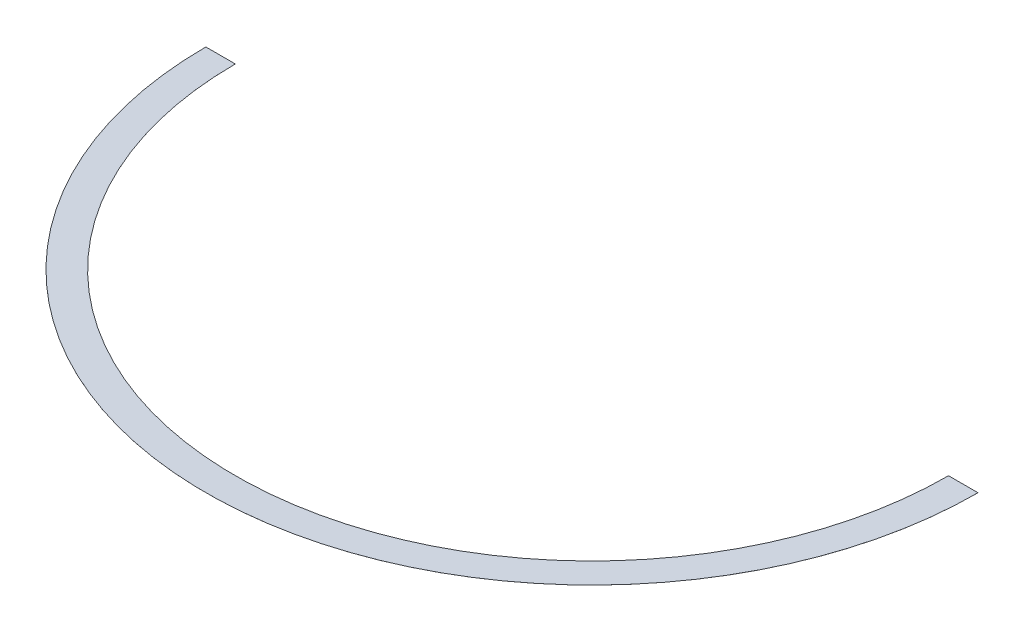
ISO-10303-21;
HEADER;
FILE_DESCRIPTION(('STEP AP214'),'2;1');
FILE_NAME('part.step','',(''),(''),'','','');
FILE_SCHEMA(('AUTOMOTIVE_DESIGN { 1 0 10303 214 1 1 1 1 }'));
ENDSEC;
DATA;
#1=APPLICATION_CONTEXT('core data for automotive mechanical design processes');
#2=APPLICATION_PROTOCOL_DEFINITION('international standard','automotive_design',2000,#1);
#3=PRODUCT_CONTEXT('',#1,'mechanical');
#4=PRODUCT('Part','Part','',(#3));
#5=PRODUCT_RELATED_PRODUCT_CATEGORY('part','',(#4));
#6=PRODUCT_DEFINITION_FORMATION('','',#4);
#7=PRODUCT_DEFINITION_CONTEXT('part definition',#1,'design');
#8=PRODUCT_DEFINITION('design','',#6,#7);
#9=PRODUCT_DEFINITION_SHAPE('','',#8);
#10=(LENGTH_UNIT() NAMED_UNIT(*) SI_UNIT(.MILLI.,.METRE.));
#11=(NAMED_UNIT(*) PLANE_ANGLE_UNIT() SI_UNIT($,.RADIAN.));
#12=(NAMED_UNIT(*) SI_UNIT($,.STERADIAN.) SOLID_ANGLE_UNIT());
#13=UNCERTAINTY_MEASURE_WITH_UNIT(LENGTH_MEASURE(1.E-05),#10,'distance_accuracy_value','');
#14=(GEOMETRIC_REPRESENTATION_CONTEXT(3) GLOBAL_UNCERTAINTY_ASSIGNED_CONTEXT((#13)) GLOBAL_UNIT_ASSIGNED_CONTEXT((#10,
#11,#12)) REPRESENTATION_CONTEXT('',''));
#15=CARTESIAN_POINT('',(0.,0.,0.));
#16=DIRECTION('',(0.,0.,1.));
#17=DIRECTION('',(1.,0.,0.));
#18=AXIS2_PLACEMENT_3D('',#15,#16,#17);
#19=CARTESIAN_POINT('',(637.155889963996,0.01,-1114.76052772189));
#20=DIRECTION('',(0.,0.,-1.));
#21=DIRECTION('',(-1.,0.,0.));
#22=AXIS2_PLACEMENT_3D('',#19,#20,#21);
#23=PLANE('',#22);
#24=DIRECTION('',(1.,0.,0.));
#25=VECTOR('',#24,1.);
#26=CARTESIAN_POINT('',(637.155889963996,0.,-1114.76052772189));
#27=LINE('',#26,#25);
#28=CARTESIAN_POINT('',(637.155889964003,0.,-1114.76052772189));
#29=VERTEX_POINT('',#28);
#30=CARTESIAN_POINT('',(656.090281198351,0.,-1114.76052772188));
#31=VERTEX_POINT('',#30);
#32=EDGE_CURVE('E110',#29,#31,#27,.T.);
#33=ORIENTED_EDGE('',*,*,#32,.F.);
#34=DIRECTION('',(0.,-1.,0.));
#35=VECTOR('',#34,1.);
#36=CARTESIAN_POINT('',(637.155889964003,0.01,-1114.76052772189));
#37=LINE('',#36,#35);
#38=CARTESIAN_POINT('',(637.155889964003,0.01,-1114.76052772189));
#39=VERTEX_POINT('',#38);
#40=EDGE_CURVE('E11',#39,#29,#37,.T.);
#41=ORIENTED_EDGE('',*,*,#40,.F.);
#42=DIRECTION('',(1.,0.,0.));
#43=VECTOR('',#42,1.);
#44=CARTESIAN_POINT('',(637.155889963996,0.01,-1114.76052772189));
#45=LINE('',#44,#43);
#46=CARTESIAN_POINT('',(656.090281198351,0.01,-1114.76052772188));
#47=VERTEX_POINT('',#46);
#48=EDGE_CURVE('E102',#39,#47,#45,.T.);
#49=ORIENTED_EDGE('',*,*,#48,.T.);
#50=DIRECTION('',(0.,-1.,0.));
#51=VECTOR('',#50,1.);
#52=CARTESIAN_POINT('',(656.090281198351,0.01,-1114.76052772188));
#53=LINE('',#52,#51);
#54=EDGE_CURVE('E42',#47,#31,#53,.T.);
#55=ORIENTED_EDGE('',*,*,#54,.T.);
#56=EDGE_LOOP('',(#33,#41,#49,#55));
#57=FACE_BOUND('',#56,.T.);
#58=ADVANCED_FACE('F39',(#57),#23,.T.);
#59=CARTESIAN_POINT('',(408.004300026305,0.01,-1114.76052772188));
#60=DIRECTION('',(0.,-1.,0.));
#61=DIRECTION('',(0.,0.,-1.));
#62=AXIS2_PLACEMENT_3D('',#59,#60,#61);
#63=CYLINDRICAL_SURFACE('',#62,229.151589937698);
#64=CARTESIAN_POINT('',(408.004300026305,0.,-1114.76052772188));
#65=DIRECTION('',(0.,-1.,0.));
#66=DIRECTION('',(0.,0.,-1.));
#67=AXIS2_PLACEMENT_3D('',#64,#65,#66);
#68=CIRCLE('',#67,229.151589937698);
#69=CARTESIAN_POINT('',(178.852710088599,0.,-1114.76052772188));
#70=VERTEX_POINT('',#69);
#71=EDGE_CURVE('E105',#29,#70,#68,.T.);
#72=ORIENTED_EDGE('',*,*,#71,.T.);
#73=DIRECTION('',(0.,-1.,0.));
#74=VECTOR('',#73,1.);
#75=CARTESIAN_POINT('',(178.852710088599,0.01,-1114.76052772188));
#76=LINE('',#75,#74);
#77=CARTESIAN_POINT('',(178.852710088599,0.01,-1114.76052772188));
#78=VERTEX_POINT('',#77);
#79=EDGE_CURVE('E49',#78,#70,#76,.T.);
#80=ORIENTED_EDGE('',*,*,#79,.F.);
#81=CARTESIAN_POINT('',(408.004300026305,0.01,-1114.76052772188));
#82=DIRECTION('',(0.,-1.,0.));
#83=DIRECTION('',(0.,0.,-1.));
#84=AXIS2_PLACEMENT_3D('',#81,#82,#83);
#85=CIRCLE('',#84,229.151589937698);
#86=EDGE_CURVE('E97',#39,#78,#85,.T.);
#87=ORIENTED_EDGE('',*,*,#86,.F.);
#88=ORIENTED_EDGE('',*,*,#40,.T.);
#89=EDGE_LOOP('',(#72,#80,#87,#88));
#90=FACE_BOUND('',#89,.T.);
#91=ADVANCED_FACE('F125',(#90),#63,.F.);
#92=CARTESIAN_POINT('',(159.918318845847,0.01,-1114.76052772188));
#93=DIRECTION('',(0.,0.,-1.));
#94=DIRECTION('',(-1.,0.,0.));
#95=AXIS2_PLACEMENT_3D('',#92,#93,#94);
#96=PLANE('',#95);
#97=DIRECTION('',(1.,0.,0.));
#98=VECTOR('',#97,1.);
#99=CARTESIAN_POINT('',(159.918318845847,0.,-1114.76052772188));
#100=LINE('',#99,#98);
#101=CARTESIAN_POINT('',(159.918318845847,0.,-1114.76052772188));
#102=VERTEX_POINT('',#101);
#103=EDGE_CURVE('E90',#102,#70,#100,.T.);
#104=ORIENTED_EDGE('',*,*,#103,.F.);
#105=DIRECTION('',(0.,-1.,0.));
#106=VECTOR('',#105,1.);
#107=CARTESIAN_POINT('',(159.918318845847,0.01,-1114.76052772188));
#108=LINE('',#107,#106);
#109=CARTESIAN_POINT('',(159.918318845847,0.01,-1114.76052772188));
#110=VERTEX_POINT('',#109);
#111=EDGE_CURVE('E85',#110,#102,#108,.T.);
#112=ORIENTED_EDGE('',*,*,#111,.F.);
#113=DIRECTION('',(1.,0.,0.));
#114=VECTOR('',#113,1.);
#115=CARTESIAN_POINT('',(159.918318845847,0.01,-1114.76052772188));
#116=LINE('',#115,#114);
#117=EDGE_CURVE('E88',#110,#78,#116,.T.);
#118=ORIENTED_EDGE('',*,*,#117,.T.);
#119=ORIENTED_EDGE('',*,*,#79,.T.);
#120=EDGE_LOOP('',(#104,#112,#118,#119));
#121=FACE_BOUND('',#120,.T.);
#122=ADVANCED_FACE('F87',(#121),#96,.T.);
#123=CARTESIAN_POINT('',(408.004300022099,0.01,-1114.76052772188));
#124=DIRECTION('',(0.,-1.,0.));
#125=DIRECTION('',(0.,0.,-1.));
#126=AXIS2_PLACEMENT_3D('',#123,#124,#125);
#127=CYLINDRICAL_SURFACE('',#126,248.085981176252);
#128=CARTESIAN_POINT('',(408.004300022099,0.,-1114.76052772188));
#129=DIRECTION('',(0.,-1.,0.));
#130=DIRECTION('',(0.,0.,-1.));
#131=AXIS2_PLACEMENT_3D('',#128,#129,#130);
#132=CIRCLE('',#131,248.085981176252);
#133=EDGE_CURVE('E114',#31,#102,#132,.T.);
#134=ORIENTED_EDGE('',*,*,#133,.F.);
#135=ORIENTED_EDGE('',*,*,#54,.F.);
#136=CARTESIAN_POINT('',(408.004300022099,0.01,-1114.76052772188));
#137=DIRECTION('',(0.,-1.,0.));
#138=DIRECTION('',(0.,0.,-1.));
#139=AXIS2_PLACEMENT_3D('',#136,#137,#138);
#140=CIRCLE('',#139,248.085981176252);
#141=EDGE_CURVE('E96',#47,#110,#140,.T.);
#142=ORIENTED_EDGE('',*,*,#141,.T.);
#143=ORIENTED_EDGE('',*,*,#111,.T.);
#144=EDGE_LOOP('',(#134,#135,#142,#143));
#145=FACE_BOUND('',#144,.T.);
#146=ADVANCED_FACE('F100',(#145),#127,.T.);
#147=CARTESIAN_POINT('',(408.004300022099,0.01,-1114.76052772188));
#148=DIRECTION('',(0.,-1.,0.));
#149=DIRECTION('',(0.,0.,-1.));
#150=AXIS2_PLACEMENT_3D('',#147,#148,#149);
#151=PLANE('',#150);
#152=ORIENTED_EDGE('',*,*,#48,.F.);
#153=ORIENTED_EDGE('',*,*,#86,.T.);
#154=ORIENTED_EDGE('',*,*,#117,.F.);
#155=ORIENTED_EDGE('',*,*,#141,.F.);
#156=EDGE_LOOP('',(#152,#153,#154,#155));
#157=FACE_BOUND('',#156,.T.);
#158=ADVANCED_FACE('F95',(#157),#151,.F.);
#159=CARTESIAN_POINT('',(408.004300022099,0.,-1114.76052772188));
#160=DIRECTION('',(0.,-1.,0.));
#161=DIRECTION('',(0.,0.,-1.));
#162=AXIS2_PLACEMENT_3D('',#159,#160,#161);
#163=PLANE('',#162);
#164=ORIENTED_EDGE('',*,*,#32,.T.);
#165=ORIENTED_EDGE('',*,*,#133,.T.);
#166=ORIENTED_EDGE('',*,*,#103,.T.);
#167=ORIENTED_EDGE('',*,*,#71,.F.);
#168=EDGE_LOOP('',(#164,#165,#166,#167));
#169=FACE_BOUND('',#168,.T.);
#170=ADVANCED_FACE('F124',(#169),#163,.T.);
#171=CLOSED_SHELL('',(#58,#91,#122,#146,#158,#170));
#172=MANIFOLD_SOLID_BREP('B2',#171);
#173=ADVANCED_BREP_SHAPE_REPRESENTATION('',(#18,#172),#14);
#174=SHAPE_DEFINITION_REPRESENTATION(#9,#173);
ENDSEC;
END-ISO-10303-21;
